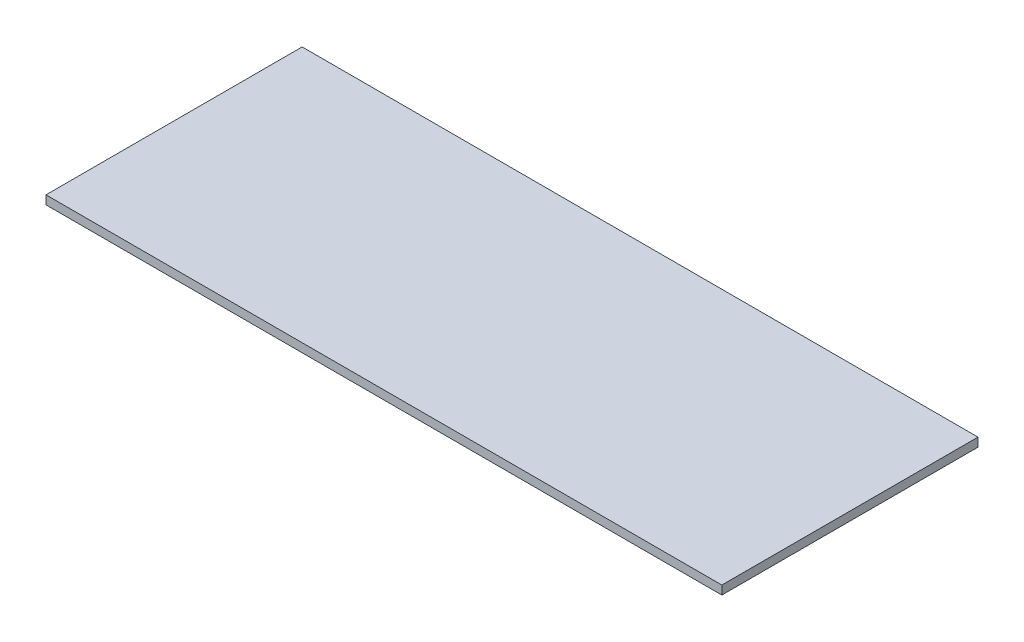
ISO-10303-21;
HEADER;
FILE_DESCRIPTION(('STEP AP214'),'2;1');
FILE_NAME('part.step','',(''),(''),'','','');
FILE_SCHEMA(('AUTOMOTIVE_DESIGN { 1 0 10303 214 1 1 1 1 }'));
ENDSEC;
DATA;
#1=APPLICATION_CONTEXT('core data for automotive mechanical design processes');
#2=APPLICATION_PROTOCOL_DEFINITION('international standard','automotive_design',2000,#1);
#3=PRODUCT_CONTEXT('',#1,'mechanical');
#4=PRODUCT('Part','Part','',(#3));
#5=PRODUCT_RELATED_PRODUCT_CATEGORY('part','',(#4));
#6=PRODUCT_DEFINITION_FORMATION('','',#4);
#7=PRODUCT_DEFINITION_CONTEXT('part definition',#1,'design');
#8=PRODUCT_DEFINITION('design','',#6,#7);
#9=PRODUCT_DEFINITION_SHAPE('','',#8);
#10=(LENGTH_UNIT() NAMED_UNIT(*) SI_UNIT(.MILLI.,.METRE.));
#11=(NAMED_UNIT(*) PLANE_ANGLE_UNIT() SI_UNIT($,.RADIAN.));
#12=(NAMED_UNIT(*) SI_UNIT($,.STERADIAN.) SOLID_ANGLE_UNIT());
#13=UNCERTAINTY_MEASURE_WITH_UNIT(LENGTH_MEASURE(1.E-05),#10,'distance_accuracy_value','');
#14=(GEOMETRIC_REPRESENTATION_CONTEXT(3) GLOBAL_UNCERTAINTY_ASSIGNED_CONTEXT((#13)) GLOBAL_UNIT_ASSIGNED_CONTEXT((#10,
#11,#12)) REPRESENTATION_CONTEXT('',''));
#15=CARTESIAN_POINT('',(0.,0.,0.));
#16=DIRECTION('',(0.,0.,1.));
#17=DIRECTION('',(1.,0.,0.));
#18=AXIS2_PLACEMENT_3D('',#15,#16,#17);
#19=CARTESIAN_POINT('',(4.4,7.2,-4.4));
#20=DIRECTION('',(1.,0.,0.));
#21=DIRECTION('',(0.,0.,-1.));
#22=AXIS2_PLACEMENT_3D('',#19,#20,#21);
#23=PLANE('',#22);
#24=DIRECTION('',(0.,0.,1.));
#25=VECTOR('',#24,1.);
#26=CARTESIAN_POINT('',(4.4,5.6,-4.4));
#27=LINE('',#26,#25);
#28=CARTESIAN_POINT('',(4.4,5.6,-51.4));
#29=VERTEX_POINT('',#28);
#30=CARTESIAN_POINT('',(4.4,5.6,-4.4));
#31=VERTEX_POINT('',#30);
#32=EDGE_CURVE('E118',#29,#31,#27,.T.);
#33=ORIENTED_EDGE('',*,*,#32,.T.);
#34=DIRECTION('',(0.,-1.,0.));
#35=VECTOR('',#34,1.);
#36=CARTESIAN_POINT('',(4.4,7.2,-4.4));
#37=LINE('',#36,#35);
#38=CARTESIAN_POINT('',(4.4,7.2,-4.4));
#39=VERTEX_POINT('',#38);
#40=EDGE_CURVE('E11',#39,#31,#37,.T.);
#41=ORIENTED_EDGE('',*,*,#40,.F.);
#42=DIRECTION('',(0.,0.,1.));
#43=VECTOR('',#42,1.);
#44=CARTESIAN_POINT('',(4.4,7.2,-4.4));
#45=LINE('',#44,#43);
#46=CARTESIAN_POINT('',(4.4,7.2,-51.4));
#47=VERTEX_POINT('',#46);
#48=EDGE_CURVE('E101',#47,#39,#45,.T.);
#49=ORIENTED_EDGE('',*,*,#48,.F.);
#50=DIRECTION('',(0.,-1.,0.));
#51=VECTOR('',#50,1.);
#52=CARTESIAN_POINT('',(4.4,7.2,-51.4));
#53=LINE('',#52,#51);
#54=EDGE_CURVE('E114',#47,#29,#53,.T.);
#55=ORIENTED_EDGE('',*,*,#54,.T.);
#56=EDGE_LOOP('',(#33,#41,#49,#55));
#57=FACE_BOUND('',#56,.T.);
#58=ADVANCED_FACE('F49',(#57),#23,.F.);
#59=CARTESIAN_POINT('',(4.4,7.2,-4.4));
#60=DIRECTION('',(0.,0.,-1.));
#61=DIRECTION('',(-1.,0.,0.));
#62=AXIS2_PLACEMENT_3D('',#59,#60,#61);
#63=PLANE('',#62);
#64=DIRECTION('',(1.,0.,0.));
#65=VECTOR('',#64,1.);
#66=CARTESIAN_POINT('',(4.4,5.6,-4.4));
#67=LINE('',#66,#65);
#68=CARTESIAN_POINT('',(128.4,5.6,-4.4));
#69=VERTEX_POINT('',#68);
#70=EDGE_CURVE('E106',#31,#69,#67,.T.);
#71=ORIENTED_EDGE('',*,*,#70,.T.);
#72=DIRECTION('',(0.,-1.,0.));
#73=VECTOR('',#72,1.);
#74=CARTESIAN_POINT('',(128.4,7.2,-4.4));
#75=LINE('',#74,#73);
#76=CARTESIAN_POINT('',(128.4,7.2,-4.4));
#77=VERTEX_POINT('',#76);
#78=EDGE_CURVE('E58',#77,#69,#75,.T.);
#79=ORIENTED_EDGE('',*,*,#78,.F.);
#80=DIRECTION('',(1.,0.,0.));
#81=VECTOR('',#80,1.);
#82=CARTESIAN_POINT('',(4.4,7.2,-4.4));
#83=LINE('',#82,#81);
#84=EDGE_CURVE('E96',#39,#77,#83,.T.);
#85=ORIENTED_EDGE('',*,*,#84,.F.);
#86=ORIENTED_EDGE('',*,*,#40,.T.);
#87=EDGE_LOOP('',(#71,#79,#85,#86));
#88=FACE_BOUND('',#87,.T.);
#89=ADVANCED_FACE('F105',(#88),#63,.F.);
#90=CARTESIAN_POINT('',(128.4,7.2,-4.4));
#91=DIRECTION('',(-1.,0.,0.));
#92=DIRECTION('',(0.,0.,1.));
#93=AXIS2_PLACEMENT_3D('',#90,#91,#92);
#94=PLANE('',#93);
#95=DIRECTION('',(0.,0.,-1.));
#96=VECTOR('',#95,1.);
#97=CARTESIAN_POINT('',(128.4,5.6,-4.4));
#98=LINE('',#97,#96);
#99=CARTESIAN_POINT('',(128.4,5.6,-51.4));
#100=VERTEX_POINT('',#99);
#101=EDGE_CURVE('E83',#69,#100,#98,.T.);
#102=ORIENTED_EDGE('',*,*,#101,.T.);
#103=DIRECTION('',(0.,-1.,0.));
#104=VECTOR('',#103,1.);
#105=CARTESIAN_POINT('',(128.4,7.2,-51.4));
#106=LINE('',#105,#104);
#107=CARTESIAN_POINT('',(128.4,7.2,-51.4));
#108=VERTEX_POINT('',#107);
#109=EDGE_CURVE('E108',#108,#100,#106,.T.);
#110=ORIENTED_EDGE('',*,*,#109,.F.);
#111=DIRECTION('',(0.,0.,-1.));
#112=VECTOR('',#111,1.);
#113=CARTESIAN_POINT('',(128.4,7.2,-4.4));
#114=LINE('',#113,#112);
#115=EDGE_CURVE('E99',#77,#108,#114,.T.);
#116=ORIENTED_EDGE('',*,*,#115,.F.);
#117=ORIENTED_EDGE('',*,*,#78,.T.);
#118=EDGE_LOOP('',(#102,#110,#116,#117));
#119=FACE_BOUND('',#118,.T.);
#120=ADVANCED_FACE('F109',(#119),#94,.F.);
#121=CARTESIAN_POINT('',(4.4,7.2,-51.4));
#122=DIRECTION('',(0.,0.,1.));
#123=DIRECTION('',(1.,0.,0.));
#124=AXIS2_PLACEMENT_3D('',#121,#122,#123);
#125=PLANE('',#124);
#126=DIRECTION('',(-1.,0.,0.));
#127=VECTOR('',#126,1.);
#128=CARTESIAN_POINT('',(4.4,5.6,-51.4));
#129=LINE('',#128,#127);
#130=EDGE_CURVE('E89',#100,#29,#129,.T.);
#131=ORIENTED_EDGE('',*,*,#130,.T.);
#132=ORIENTED_EDGE('',*,*,#54,.F.);
#133=DIRECTION('',(-1.,0.,0.));
#134=VECTOR('',#133,1.);
#135=CARTESIAN_POINT('',(4.4,7.2,-51.4));
#136=LINE('',#135,#134);
#137=EDGE_CURVE('E66',#108,#47,#136,.T.);
#138=ORIENTED_EDGE('',*,*,#137,.F.);
#139=ORIENTED_EDGE('',*,*,#109,.T.);
#140=EDGE_LOOP('',(#131,#132,#138,#139));
#141=FACE_BOUND('',#140,.T.);
#142=ADVANCED_FACE('F132',(#141),#125,.F.);
#143=CARTESIAN_POINT('',(0.,7.2,0.));
#144=DIRECTION('',(0.,-1.,0.));
#145=DIRECTION('',(0.,0.,-1.));
#146=AXIS2_PLACEMENT_3D('',#143,#144,#145);
#147=PLANE('',#146);
#148=ORIENTED_EDGE('',*,*,#48,.T.);
#149=ORIENTED_EDGE('',*,*,#84,.T.);
#150=ORIENTED_EDGE('',*,*,#115,.T.);
#151=ORIENTED_EDGE('',*,*,#137,.T.);
#152=EDGE_LOOP('',(#148,#149,#150,#151));
#153=FACE_BOUND('',#152,.T.);
#154=ADVANCED_FACE('F97',(#153),#147,.F.);
#155=CARTESIAN_POINT('',(0.,5.6,0.));
#156=DIRECTION('',(0.,-1.,0.));
#157=DIRECTION('',(0.,0.,-1.));
#158=AXIS2_PLACEMENT_3D('',#155,#156,#157);
#159=PLANE('',#158);
#160=ORIENTED_EDGE('',*,*,#32,.F.);
#161=ORIENTED_EDGE('',*,*,#130,.F.);
#162=ORIENTED_EDGE('',*,*,#101,.F.);
#163=ORIENTED_EDGE('',*,*,#70,.F.);
#164=EDGE_LOOP('',(#160,#161,#162,#163));
#165=FACE_BOUND('',#164,.T.);
#166=ADVANCED_FACE('F135',(#165),#159,.T.);
#167=CLOSED_SHELL('',(#58,#89,#120,#142,#154,#166));
#168=MANIFOLD_SOLID_BREP('B2',#167);
#169=ADVANCED_BREP_SHAPE_REPRESENTATION('',(#18,#168),#14);
#170=SHAPE_DEFINITION_REPRESENTATION(#9,#169);
ENDSEC;
END-ISO-10303-21;
